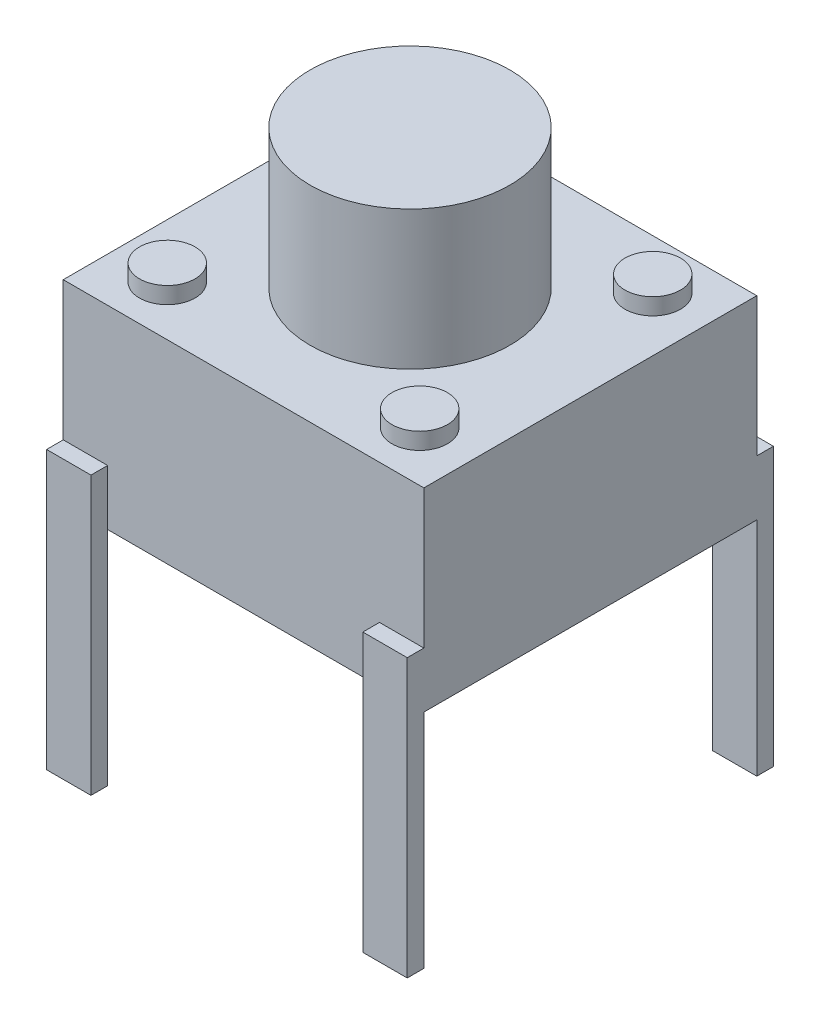
ISO-10303-21;
HEADER;
FILE_DESCRIPTION(('STEP AP214'),'2;1');
FILE_NAME('part.step','',(''),(''),'','','');
FILE_SCHEMA(('AUTOMOTIVE_DESIGN { 1 0 10303 214 1 1 1 1 }'));
ENDSEC;
DATA;
#1=APPLICATION_CONTEXT('core data for automotive mechanical design processes');
#2=APPLICATION_PROTOCOL_DEFINITION('international standard','automotive_design',2000,#1);
#3=PRODUCT_CONTEXT('',#1,'mechanical');
#4=PRODUCT('Part','Part','',(#3));
#5=PRODUCT_RELATED_PRODUCT_CATEGORY('part','',(#4));
#6=PRODUCT_DEFINITION_FORMATION('','',#4);
#7=PRODUCT_DEFINITION_CONTEXT('part definition',#1,'design');
#8=PRODUCT_DEFINITION('design','',#6,#7);
#9=PRODUCT_DEFINITION_SHAPE('','',#8);
#10=(LENGTH_UNIT() NAMED_UNIT(*) SI_UNIT(.MILLI.,.METRE.));
#11=(NAMED_UNIT(*) PLANE_ANGLE_UNIT() SI_UNIT($,.RADIAN.));
#12=(NAMED_UNIT(*) SI_UNIT($,.STERADIAN.) SOLID_ANGLE_UNIT());
#13=UNCERTAINTY_MEASURE_WITH_UNIT(LENGTH_MEASURE(1.E-05),#10,'distance_accuracy_value','');
#14=(GEOMETRIC_REPRESENTATION_CONTEXT(3) GLOBAL_UNCERTAINTY_ASSIGNED_CONTEXT((#13)) GLOBAL_UNIT_ASSIGNED_CONTEXT((#10,
#11,#12)) REPRESENTATION_CONTEXT('',''));
#15=CARTESIAN_POINT('',(0.,0.,0.));
#16=DIRECTION('',(0.,0.,1.));
#17=DIRECTION('',(1.,0.,0.));
#18=AXIS2_PLACEMENT_3D('',#15,#16,#17);
#19=CARTESIAN_POINT('',(-3.25,3.5,-3.));
#20=DIRECTION('',(0.,0.,-1.));
#21=DIRECTION('',(-1.,0.,0.));
#22=AXIS2_PLACEMENT_3D('',#19,#20,#21);
#23=PLANE('',#22);
#24=DIRECTION('',(-1.,0.,0.));
#25=VECTOR('',#24,1.);
#26=CARTESIAN_POINT('',(2.45,1.,-3.));
#27=LINE('',#26,#25);
#28=CARTESIAN_POINT('',(3.25,1.,-3.));
#29=VERTEX_POINT('',#28);
#30=CARTESIAN_POINT('',(2.45,1.,-3.));
#31=VERTEX_POINT('',#30);
#32=EDGE_CURVE('E212',#29,#31,#27,.T.);
#33=ORIENTED_EDGE('',*,*,#32,.T.);
#34=DIRECTION('',(0.,1.,0.));
#35=VECTOR('',#34,1.);
#36=CARTESIAN_POINT('',(2.45,-4.,-3.));
#37=LINE('',#36,#35);
#38=CARTESIAN_POINT('',(2.45,0.,-3.));
#39=VERTEX_POINT('',#38);
#40=EDGE_CURVE('E399',#39,#31,#37,.T.);
#41=ORIENTED_EDGE('',*,*,#40,.F.);
#42=DIRECTION('',(1.,0.,0.));
#43=VECTOR('',#42,1.);
#44=CARTESIAN_POINT('',(-3.25,0.,-3.));
#45=LINE('',#44,#43);
#46=CARTESIAN_POINT('',(-2.45,0.,-3.));
#47=VERTEX_POINT('',#46);
#48=EDGE_CURVE('E359',#47,#39,#45,.T.);
#49=ORIENTED_EDGE('',*,*,#48,.F.);
#50=DIRECTION('',(0.,1.,0.));
#51=VECTOR('',#50,1.);
#52=CARTESIAN_POINT('',(-2.45,-4.,-3.));
#53=LINE('',#52,#51);
#54=CARTESIAN_POINT('',(-2.45,1.,-3.));
#55=VERTEX_POINT('',#54);
#56=EDGE_CURVE('E11',#47,#55,#53,.T.);
#57=ORIENTED_EDGE('',*,*,#56,.T.);
#58=DIRECTION('',(-1.,0.,0.));
#59=VECTOR('',#58,1.);
#60=CARTESIAN_POINT('',(-3.25,1.,-3.));
#61=LINE('',#60,#59);
#62=CARTESIAN_POINT('',(-3.25,1.,-3.));
#63=VERTEX_POINT('',#62);
#64=EDGE_CURVE('E56',#55,#63,#61,.T.);
#65=ORIENTED_EDGE('',*,*,#64,.T.);
#66=DIRECTION('',(0.,-1.,0.));
#67=VECTOR('',#66,1.);
#68=CARTESIAN_POINT('',(-3.25,3.5,-3.));
#69=LINE('',#68,#67);
#70=CARTESIAN_POINT('',(-3.25,3.5,-3.));
#71=VERTEX_POINT('',#70);
#72=EDGE_CURVE('E42',#71,#63,#69,.T.);
#73=ORIENTED_EDGE('',*,*,#72,.F.);
#74=DIRECTION('',(1.,0.,0.));
#75=VECTOR('',#74,1.);
#76=CARTESIAN_POINT('',(-3.25,3.5,-3.));
#77=LINE('',#76,#75);
#78=CARTESIAN_POINT('',(3.25,3.5,-3.));
#79=VERTEX_POINT('',#78);
#80=EDGE_CURVE('E344',#71,#79,#77,.T.);
#81=ORIENTED_EDGE('',*,*,#80,.T.);
#82=DIRECTION('',(0.,-1.,0.));
#83=VECTOR('',#82,1.);
#84=CARTESIAN_POINT('',(3.25,3.5,-3.));
#85=LINE('',#84,#83);
#86=EDGE_CURVE('E369',#79,#29,#85,.T.);
#87=ORIENTED_EDGE('',*,*,#86,.T.);
#88=EDGE_LOOP('',(#33,#41,#49,#57,#65,#73,#81,#87));
#89=FACE_BOUND('',#88,.T.);
#90=ADVANCED_FACE('F38',(#89),#23,.T.);
#91=CARTESIAN_POINT('',(-3.25,3.5,3.));
#92=DIRECTION('',(0.,0.,-1.));
#93=DIRECTION('',(-1.,0.,0.));
#94=AXIS2_PLACEMENT_3D('',#91,#92,#93);
#95=PLANE('',#94);
#96=DIRECTION('',(0.,1.,0.));
#97=VECTOR('',#96,1.);
#98=CARTESIAN_POINT('',(2.45,-4.,3.));
#99=LINE('',#98,#97);
#100=CARTESIAN_POINT('',(2.45,0.,3.));
#101=VERTEX_POINT('',#100);
#102=CARTESIAN_POINT('',(2.45,1.,3.));
#103=VERTEX_POINT('',#102);
#104=EDGE_CURVE('E64',#101,#103,#99,.T.);
#105=ORIENTED_EDGE('',*,*,#104,.T.);
#106=DIRECTION('',(1.,0.,0.));
#107=VECTOR('',#106,1.);
#108=CARTESIAN_POINT('',(3.25,1.,3.));
#109=LINE('',#108,#107);
#110=CARTESIAN_POINT('',(3.25,1.,3.));
#111=VERTEX_POINT('',#110);
#112=EDGE_CURVE('E254',#103,#111,#109,.T.);
#113=ORIENTED_EDGE('',*,*,#112,.T.);
#114=DIRECTION('',(0.,-1.,0.));
#115=VECTOR('',#114,1.);
#116=CARTESIAN_POINT('',(3.25,3.5,3.));
#117=LINE('',#116,#115);
#118=CARTESIAN_POINT('',(3.25,3.5,3.));
#119=VERTEX_POINT('',#118);
#120=EDGE_CURVE('E367',#119,#111,#117,.T.);
#121=ORIENTED_EDGE('',*,*,#120,.F.);
#122=DIRECTION('',(1.,0.,0.));
#123=VECTOR('',#122,1.);
#124=CARTESIAN_POINT('',(-3.25,3.5,3.));
#125=LINE('',#124,#123);
#126=CARTESIAN_POINT('',(-3.25,3.5,3.));
#127=VERTEX_POINT('',#126);
#128=EDGE_CURVE('E350',#127,#119,#125,.T.);
#129=ORIENTED_EDGE('',*,*,#128,.F.);
#130=DIRECTION('',(0.,-1.,0.));
#131=VECTOR('',#130,1.);
#132=CARTESIAN_POINT('',(-3.25,3.5,3.));
#133=LINE('',#132,#131);
#134=CARTESIAN_POINT('',(-3.25,1.,3.));
#135=VERTEX_POINT('',#134);
#136=EDGE_CURVE('E340',#127,#135,#133,.T.);
#137=ORIENTED_EDGE('',*,*,#136,.T.);
#138=DIRECTION('',(1.,0.,0.));
#139=VECTOR('',#138,1.);
#140=CARTESIAN_POINT('',(-3.25,1.,3.));
#141=LINE('',#140,#139);
#142=CARTESIAN_POINT('',(-2.45,1.,3.));
#143=VERTEX_POINT('',#142);
#144=EDGE_CURVE('E293',#135,#143,#141,.T.);
#145=ORIENTED_EDGE('',*,*,#144,.T.);
#146=DIRECTION('',(0.,1.,0.));
#147=VECTOR('',#146,1.);
#148=CARTESIAN_POINT('',(-2.45,-4.,3.));
#149=LINE('',#148,#147);
#150=CARTESIAN_POINT('',(-2.45,0.,3.));
#151=VERTEX_POINT('',#150);
#152=EDGE_CURVE('E47',#151,#143,#149,.T.);
#153=ORIENTED_EDGE('',*,*,#152,.F.);
#154=DIRECTION('',(1.,0.,0.));
#155=VECTOR('',#154,1.);
#156=CARTESIAN_POINT('',(-3.25,0.,3.));
#157=LINE('',#156,#155);
#158=EDGE_CURVE('E365',#151,#101,#157,.T.);
#159=ORIENTED_EDGE('',*,*,#158,.T.);
#160=EDGE_LOOP('',(#105,#113,#121,#129,#137,#145,#153,#159));
#161=FACE_BOUND('',#160,.T.);
#162=ADVANCED_FACE('F417',(#161),#95,.F.);
#163=CARTESIAN_POINT('',(-3.25,3.5,3.));
#164=DIRECTION('',(-1.,0.,0.));
#165=DIRECTION('',(0.,0.,1.));
#166=AXIS2_PLACEMENT_3D('',#163,#164,#165);
#167=PLANE('',#166);
#168=DIRECTION('',(0.,0.,-1.));
#169=VECTOR('',#168,1.);
#170=CARTESIAN_POINT('',(-3.25,0.,3.));
#171=LINE('',#170,#169);
#172=CARTESIAN_POINT('',(-3.25,0.,3.));
#173=VERTEX_POINT('',#172);
#174=CARTESIAN_POINT('',(-3.25,0.,-3.));
#175=VERTEX_POINT('',#174);
#176=EDGE_CURVE('E336',#173,#175,#171,.T.);
#177=ORIENTED_EDGE('',*,*,#176,.F.);
#178=DIRECTION('',(0.,1.,0.));
#179=VECTOR('',#178,1.);
#180=CARTESIAN_POINT('',(-3.25,-4.,3.));
#181=LINE('',#180,#179);
#182=CARTESIAN_POINT('',(-3.25,-4.,3.));
#183=VERTEX_POINT('',#182);
#184=EDGE_CURVE('E306',#183,#173,#181,.T.);
#185=ORIENTED_EDGE('',*,*,#184,.F.);
#186=DIRECTION('',(0.,0.,-1.));
#187=VECTOR('',#186,1.);
#188=CARTESIAN_POINT('',(-3.25,-4.,3.));
#189=LINE('',#188,#187);
#190=CARTESIAN_POINT('',(-3.25,-4.,3.3));
#191=VERTEX_POINT('',#190);
#192=EDGE_CURVE('E280',#191,#183,#189,.T.);
#193=ORIENTED_EDGE('',*,*,#192,.F.);
#194=DIRECTION('',(0.,1.,0.));
#195=VECTOR('',#194,1.);
#196=CARTESIAN_POINT('',(-3.25,-4.,3.3));
#197=LINE('',#196,#195);
#198=CARTESIAN_POINT('',(-3.25,1.,3.3));
#199=VERTEX_POINT('',#198);
#200=EDGE_CURVE('E290',#191,#199,#197,.T.);
#201=ORIENTED_EDGE('',*,*,#200,.T.);
#202=DIRECTION('',(0.,0.,-1.));
#203=VECTOR('',#202,1.);
#204=CARTESIAN_POINT('',(-3.25,1.,3.));
#205=LINE('',#204,#203);
#206=EDGE_CURVE('E279',#199,#135,#205,.T.);
#207=ORIENTED_EDGE('',*,*,#206,.T.);
#208=ORIENTED_EDGE('',*,*,#136,.F.);
#209=DIRECTION('',(0.,0.,-1.));
#210=VECTOR('',#209,1.);
#211=CARTESIAN_POINT('',(-3.25,3.5,3.));
#212=LINE('',#211,#210);
#213=EDGE_CURVE('E341',#127,#71,#212,.T.);
#214=ORIENTED_EDGE('',*,*,#213,.T.);
#215=ORIENTED_EDGE('',*,*,#72,.T.);
#216=DIRECTION('',(0.,0.,-1.));
#217=VECTOR('',#216,1.);
#218=CARTESIAN_POINT('',(-3.25,1.,-3.));
#219=LINE('',#218,#217);
#220=CARTESIAN_POINT('',(-3.25,1.,-3.3));
#221=VERTEX_POINT('',#220);
#222=EDGE_CURVE('E217',#63,#221,#219,.T.);
#223=ORIENTED_EDGE('',*,*,#222,.T.);
#224=DIRECTION('',(0.,1.,0.));
#225=VECTOR('',#224,1.);
#226=CARTESIAN_POINT('',(-3.25,-4.,-3.3));
#227=LINE('',#226,#225);
#228=CARTESIAN_POINT('',(-3.25,-4.,-3.3));
#229=VERTEX_POINT('',#228);
#230=EDGE_CURVE('E246',#229,#221,#227,.T.);
#231=ORIENTED_EDGE('',*,*,#230,.F.);
#232=DIRECTION('',(0.,0.,-1.));
#233=VECTOR('',#232,1.);
#234=CARTESIAN_POINT('',(-3.25,-4.,-3.));
#235=LINE('',#234,#233);
#236=CARTESIAN_POINT('',(-3.25,-4.,-3.));
#237=VERTEX_POINT('',#236);
#238=EDGE_CURVE('E226',#237,#229,#235,.T.);
#239=ORIENTED_EDGE('',*,*,#238,.F.);
#240=DIRECTION('',(0.,1.,0.));
#241=VECTOR('',#240,1.);
#242=CARTESIAN_POINT('',(-3.25,-4.,-3.));
#243=LINE('',#242,#241);
#244=EDGE_CURVE('E234',#237,#175,#243,.T.);
#245=ORIENTED_EDGE('',*,*,#244,.T.);
#246=EDGE_LOOP('',(#177,#185,#193,#201,#207,#208,#214,#215,#223,#231,#239,#245));
#247=FACE_BOUND('',#246,.T.);
#248=ADVANCED_FACE('F40',(#247),#167,.T.);
#249=CARTESIAN_POINT('',(3.25,3.5,3.));
#250=DIRECTION('',(-1.,0.,0.));
#251=DIRECTION('',(0.,0.,1.));
#252=AXIS2_PLACEMENT_3D('',#249,#250,#251);
#253=PLANE('',#252);
#254=DIRECTION('',(0.,0.,-1.));
#255=VECTOR('',#254,1.);
#256=CARTESIAN_POINT('',(3.25,0.,3.));
#257=LINE('',#256,#255);
#258=CARTESIAN_POINT('',(3.25,0.,3.));
#259=VERTEX_POINT('',#258);
#260=CARTESIAN_POINT('',(3.25,0.,-3.));
#261=VERTEX_POINT('',#260);
#262=EDGE_CURVE('E358',#259,#261,#257,.T.);
#263=ORIENTED_EDGE('',*,*,#262,.T.);
#264=DIRECTION('',(0.,1.,0.));
#265=VECTOR('',#264,1.);
#266=CARTESIAN_POINT('',(3.25,-4.,-3.));
#267=LINE('',#266,#265);
#268=CARTESIAN_POINT('',(3.25,-4.,-3.));
#269=VERTEX_POINT('',#268);
#270=EDGE_CURVE('E222',#269,#261,#267,.T.);
#271=ORIENTED_EDGE('',*,*,#270,.F.);
#272=DIRECTION('',(0.,0.,1.));
#273=VECTOR('',#272,1.);
#274=CARTESIAN_POINT('',(3.25,-4.,-3.));
#275=LINE('',#274,#273);
#276=CARTESIAN_POINT('',(3.25,-4.,-3.3));
#277=VERTEX_POINT('',#276);
#278=EDGE_CURVE('E202',#277,#269,#275,.T.);
#279=ORIENTED_EDGE('',*,*,#278,.F.);
#280=DIRECTION('',(0.,1.,0.));
#281=VECTOR('',#280,1.);
#282=CARTESIAN_POINT('',(3.25,-4.,-3.3));
#283=LINE('',#282,#281);
#284=CARTESIAN_POINT('',(3.25,1.,-3.3));
#285=VERTEX_POINT('',#284);
#286=EDGE_CURVE('E199',#277,#285,#283,.T.);
#287=ORIENTED_EDGE('',*,*,#286,.T.);
#288=DIRECTION('',(0.,0.,1.));
#289=VECTOR('',#288,1.);
#290=CARTESIAN_POINT('',(3.25,1.,-3.));
#291=LINE('',#290,#289);
#292=EDGE_CURVE('E388',#285,#29,#291,.T.);
#293=ORIENTED_EDGE('',*,*,#292,.T.);
#294=ORIENTED_EDGE('',*,*,#86,.F.);
#295=DIRECTION('',(0.,0.,-1.));
#296=VECTOR('',#295,1.);
#297=CARTESIAN_POINT('',(3.25,3.5,3.));
#298=LINE('',#297,#296);
#299=EDGE_CURVE('E348',#119,#79,#298,.T.);
#300=ORIENTED_EDGE('',*,*,#299,.F.);
#301=ORIENTED_EDGE('',*,*,#120,.T.);
#302=DIRECTION('',(0.,0.,1.));
#303=VECTOR('',#302,1.);
#304=CARTESIAN_POINT('',(3.25,1.,3.));
#305=LINE('',#304,#303);
#306=CARTESIAN_POINT('',(3.25,1.,3.3));
#307=VERTEX_POINT('',#306);
#308=EDGE_CURVE('E249',#111,#307,#305,.T.);
#309=ORIENTED_EDGE('',*,*,#308,.T.);
#310=DIRECTION('',(0.,1.,0.));
#311=VECTOR('',#310,1.);
#312=CARTESIAN_POINT('',(3.25,-4.,3.3));
#313=LINE('',#312,#311);
#314=CARTESIAN_POINT('',(3.25,-4.,3.3));
#315=VERTEX_POINT('',#314);
#316=EDGE_CURVE('E276',#315,#307,#313,.T.);
#317=ORIENTED_EDGE('',*,*,#316,.F.);
#318=DIRECTION('',(0.,0.,1.));
#319=VECTOR('',#318,1.);
#320=CARTESIAN_POINT('',(3.25,-4.,3.));
#321=LINE('',#320,#319);
#322=CARTESIAN_POINT('',(3.25,-4.,3.));
#323=VERTEX_POINT('',#322);
#324=EDGE_CURVE('E250',#323,#315,#321,.T.);
#325=ORIENTED_EDGE('',*,*,#324,.F.);
#326=DIRECTION('',(0.,1.,0.));
#327=VECTOR('',#326,1.);
#328=CARTESIAN_POINT('',(3.25,-4.,3.));
#329=LINE('',#328,#327);
#330=EDGE_CURVE('E260',#323,#259,#329,.T.);
#331=ORIENTED_EDGE('',*,*,#330,.T.);
#332=EDGE_LOOP('',(#263,#271,#279,#287,#293,#294,#300,#301,#309,#317,#325,#331));
#333=FACE_BOUND('',#332,.T.);
#334=ADVANCED_FACE('F386',(#333),#253,.F.);
#335=CARTESIAN_POINT('',(0.,3.5,0.));
#336=DIRECTION('',(0.,-1.,0.));
#337=DIRECTION('',(0.,0.,-1.));
#338=AXIS2_PLACEMENT_3D('',#335,#336,#337);
#339=PLANE('',#338);
#340=CARTESIAN_POINT('',(2.275,3.5,2.1));
#341=DIRECTION('',(0.,-1.,0.));
#342=DIRECTION('',(0.,0.,-1.));
#343=AXIS2_PLACEMENT_3D('',#340,#341,#342);
#344=CIRCLE('',#343,0.5);
#345=CARTESIAN_POINT('',(2.275,3.5,1.6));
#346=VERTEX_POINT('',#345);
#347=EDGE_CURVE('E310',#346,#346,#344,.T.);
#348=ORIENTED_EDGE('',*,*,#347,.T.);
#349=EDGE_LOOP('',(#348));
#350=FACE_BOUND('',#349,.T.);
#351=CARTESIAN_POINT('',(2.275,3.5,-2.1));
#352=DIRECTION('',(0.,-1.,0.));
#353=DIRECTION('',(0.,0.,-1.));
#354=AXIS2_PLACEMENT_3D('',#351,#352,#353);
#355=CIRCLE('',#354,0.5);
#356=CARTESIAN_POINT('',(2.275,3.5,-2.6));
#357=VERTEX_POINT('',#356);
#358=EDGE_CURVE('E316',#357,#357,#355,.T.);
#359=ORIENTED_EDGE('',*,*,#358,.T.);
#360=EDGE_LOOP('',(#359));
#361=FACE_BOUND('',#360,.T.);
#362=CARTESIAN_POINT('',(-2.275,3.5,2.1));
#363=DIRECTION('',(0.,-1.,0.));
#364=DIRECTION('',(0.,0.,-1.));
#365=AXIS2_PLACEMENT_3D('',#362,#363,#364);
#366=CIRCLE('',#365,0.5);
#367=CARTESIAN_POINT('',(-2.275,3.5,1.6));
#368=VERTEX_POINT('',#367);
#369=EDGE_CURVE('E322',#368,#368,#366,.T.);
#370=ORIENTED_EDGE('',*,*,#369,.T.);
#371=EDGE_LOOP('',(#370));
#372=FACE_BOUND('',#371,.T.);
#373=CARTESIAN_POINT('',(-2.275,3.5,-2.1));
#374=DIRECTION('',(0.,-1.,0.));
#375=DIRECTION('',(0.,0.,-1.));
#376=AXIS2_PLACEMENT_3D('',#373,#374,#375);
#377=CIRCLE('',#376,0.5);
#378=CARTESIAN_POINT('',(-2.275,3.5,-2.6));
#379=VERTEX_POINT('',#378);
#380=EDGE_CURVE('E325',#379,#379,#377,.T.);
#381=ORIENTED_EDGE('',*,*,#380,.T.);
#382=EDGE_LOOP('',(#381));
#383=FACE_BOUND('',#382,.T.);
#384=CARTESIAN_POINT('',(0.,3.5,0.));
#385=DIRECTION('',(0.,-1.,0.));
#386=DIRECTION('',(0.,0.,-1.));
#387=AXIS2_PLACEMENT_3D('',#384,#385,#386);
#388=CIRCLE('',#387,1.8);
#389=CARTESIAN_POINT('',(0.,3.5,-1.8));
#390=VERTEX_POINT('',#389);
#391=EDGE_CURVE('E337',#390,#390,#388,.F.);
#392=ORIENTED_EDGE('',*,*,#391,.F.);
#393=EDGE_LOOP('',(#392));
#394=FACE_BOUND('',#393,.T.);
#395=ORIENTED_EDGE('',*,*,#213,.F.);
#396=ORIENTED_EDGE('',*,*,#128,.T.);
#397=ORIENTED_EDGE('',*,*,#299,.T.);
#398=ORIENTED_EDGE('',*,*,#80,.F.);
#399=EDGE_LOOP('',(#395,#396,#397,#398));
#400=FACE_BOUND('',#399,.T.);
#401=ADVANCED_FACE('F381',(#350,#361,#372,#383,#394,#400),#339,.F.);
#402=CARTESIAN_POINT('',(0.,0.,0.));
#403=DIRECTION('',(0.,-1.,0.));
#404=DIRECTION('',(0.,0.,-1.));
#405=AXIS2_PLACEMENT_3D('',#402,#403,#404);
#406=PLANE('',#405);
#407=ORIENTED_EDGE('',*,*,#176,.T.);
#408=EDGE_CURVE('E355',#175,#47,#45,.T.);
#409=ORIENTED_EDGE('',*,*,#408,.T.);
#410=ORIENTED_EDGE('',*,*,#48,.T.);
#411=EDGE_CURVE('E354',#39,#261,#45,.T.);
#412=ORIENTED_EDGE('',*,*,#411,.T.);
#413=ORIENTED_EDGE('',*,*,#262,.F.);
#414=EDGE_CURVE('E362',#101,#259,#157,.T.);
#415=ORIENTED_EDGE('',*,*,#414,.F.);
#416=ORIENTED_EDGE('',*,*,#158,.F.);
#417=EDGE_CURVE('E345',#173,#151,#157,.T.);
#418=ORIENTED_EDGE('',*,*,#417,.F.);
#419=EDGE_LOOP('',(#407,#409,#410,#412,#413,#415,#416,#418));
#420=FACE_BOUND('',#419,.T.);
#421=ADVANCED_FACE('F406',(#420),#406,.T.);
#422=CARTESIAN_POINT('',(0.,6.,0.));
#423=DIRECTION('',(0.,-1.,0.));
#424=DIRECTION('',(0.,0.,-1.));
#425=AXIS2_PLACEMENT_3D('',#422,#423,#424);
#426=CYLINDRICAL_SURFACE('',#425,1.8);
#427=CARTESIAN_POINT('',(0.,6.,0.));
#428=DIRECTION('',(0.,1.,0.));
#429=DIRECTION('',(0.,0.,1.));
#430=AXIS2_PLACEMENT_3D('',#427,#428,#429);
#431=CIRCLE('',#430,1.8);
#432=CARTESIAN_POINT('',(0.,6.,1.8));
#433=VERTEX_POINT('',#432);
#434=EDGE_CURVE('E331',#433,#433,#431,.T.);
#435=ORIENTED_EDGE('',*,*,#434,.F.);
#436=EDGE_LOOP('',(#435));
#437=FACE_BOUND('',#436,.T.);
#438=ORIENTED_EDGE('',*,*,#391,.T.);
#439=EDGE_LOOP('',(#438));
#440=FACE_BOUND('',#439,.T.);
#441=ADVANCED_FACE('F452',(#437,#440),#426,.T.);
#442=CARTESIAN_POINT('',(0.,6.,0.));
#443=DIRECTION('',(0.,1.,0.));
#444=DIRECTION('',(0.,0.,1.));
#445=AXIS2_PLACEMENT_3D('',#442,#443,#444);
#446=PLANE('',#445);
#447=ORIENTED_EDGE('',*,*,#434,.T.);
#448=EDGE_LOOP('',(#447));
#449=FACE_BOUND('',#448,.T.);
#450=ADVANCED_FACE('F458',(#449),#446,.T.);
#451=CARTESIAN_POINT('',(-2.275,3.8,-2.1));
#452=DIRECTION('',(0.,-1.,0.));
#453=DIRECTION('',(0.,0.,-1.));
#454=AXIS2_PLACEMENT_3D('',#451,#452,#453);
#455=CYLINDRICAL_SURFACE('',#454,0.5);
#456=CARTESIAN_POINT('',(-2.275,3.8,-2.1));
#457=DIRECTION('',(0.,-1.,0.));
#458=DIRECTION('',(0.,0.,-1.));
#459=AXIS2_PLACEMENT_3D('',#456,#457,#458);
#460=CIRCLE('',#459,0.5);
#461=CARTESIAN_POINT('',(-2.275,3.8,-2.6));
#462=VERTEX_POINT('',#461);
#463=EDGE_CURVE('E328',#462,#462,#460,.T.);
#464=ORIENTED_EDGE('',*,*,#463,.T.);
#465=EDGE_LOOP('',(#464));
#466=FACE_BOUND('',#465,.T.);
#467=ORIENTED_EDGE('',*,*,#380,.F.);
#468=EDGE_LOOP('',(#467));
#469=FACE_BOUND('',#468,.T.);
#470=ADVANCED_FACE('F462',(#466,#469),#455,.T.);
#471=CARTESIAN_POINT('',(-2.275,3.8,-2.1));
#472=DIRECTION('',(0.,-1.,0.));
#473=DIRECTION('',(0.,0.,-1.));
#474=AXIS2_PLACEMENT_3D('',#471,#472,#473);
#475=PLANE('',#474);
#476=ORIENTED_EDGE('',*,*,#463,.F.);
#477=EDGE_LOOP('',(#476));
#478=FACE_BOUND('',#477,.T.);
#479=ADVANCED_FACE('F466',(#478),#475,.F.);
#480=CARTESIAN_POINT('',(-2.275,3.8,2.1));
#481=DIRECTION('',(0.,-1.,0.));
#482=DIRECTION('',(0.,0.,-1.));
#483=AXIS2_PLACEMENT_3D('',#480,#481,#482);
#484=CYLINDRICAL_SURFACE('',#483,0.5);
#485=CARTESIAN_POINT('',(-2.275,3.8,2.1));
#486=DIRECTION('',(0.,-1.,0.));
#487=DIRECTION('',(0.,0.,-1.));
#488=AXIS2_PLACEMENT_3D('',#485,#486,#487);
#489=CIRCLE('',#488,0.5);
#490=CARTESIAN_POINT('',(-2.275,3.8,1.6));
#491=VERTEX_POINT('',#490);
#492=EDGE_CURVE('E319',#491,#491,#489,.T.);
#493=ORIENTED_EDGE('',*,*,#492,.T.);
#494=EDGE_LOOP('',(#493));
#495=FACE_BOUND('',#494,.T.);
#496=ORIENTED_EDGE('',*,*,#369,.F.);
#497=EDGE_LOOP('',(#496));
#498=FACE_BOUND('',#497,.T.);
#499=ADVANCED_FACE('F470',(#495,#498),#484,.T.);
#500=CARTESIAN_POINT('',(-2.275,3.8,2.1));
#501=DIRECTION('',(0.,-1.,0.));
#502=DIRECTION('',(0.,0.,-1.));
#503=AXIS2_PLACEMENT_3D('',#500,#501,#502);
#504=PLANE('',#503);
#505=ORIENTED_EDGE('',*,*,#492,.F.);
#506=EDGE_LOOP('',(#505));
#507=FACE_BOUND('',#506,.T.);
#508=ADVANCED_FACE('F472',(#507),#504,.F.);
#509=CARTESIAN_POINT('',(2.275,3.8,-2.1));
#510=DIRECTION('',(0.,-1.,0.));
#511=DIRECTION('',(0.,0.,-1.));
#512=AXIS2_PLACEMENT_3D('',#509,#510,#511);
#513=CYLINDRICAL_SURFACE('',#512,0.5);
#514=CARTESIAN_POINT('',(2.275,3.8,-2.1));
#515=DIRECTION('',(0.,-1.,0.));
#516=DIRECTION('',(0.,0.,-1.));
#517=AXIS2_PLACEMENT_3D('',#514,#515,#516);
#518=CIRCLE('',#517,0.5);
#519=CARTESIAN_POINT('',(2.275,3.8,-2.6));
#520=VERTEX_POINT('',#519);
#521=EDGE_CURVE('E313',#520,#520,#518,.T.);
#522=ORIENTED_EDGE('',*,*,#521,.T.);
#523=EDGE_LOOP('',(#522));
#524=FACE_BOUND('',#523,.T.);
#525=ORIENTED_EDGE('',*,*,#358,.F.);
#526=EDGE_LOOP('',(#525));
#527=FACE_BOUND('',#526,.T.);
#528=ADVANCED_FACE('F475',(#524,#527),#513,.T.);
#529=CARTESIAN_POINT('',(2.275,3.8,-2.1));
#530=DIRECTION('',(0.,-1.,0.));
#531=DIRECTION('',(0.,0.,-1.));
#532=AXIS2_PLACEMENT_3D('',#529,#530,#531);
#533=PLANE('',#532);
#534=ORIENTED_EDGE('',*,*,#521,.F.);
#535=EDGE_LOOP('',(#534));
#536=FACE_BOUND('',#535,.T.);
#537=ADVANCED_FACE('F480',(#536),#533,.F.);
#538=CARTESIAN_POINT('',(2.275,3.8,2.1));
#539=DIRECTION('',(0.,-1.,0.));
#540=DIRECTION('',(0.,0.,-1.));
#541=AXIS2_PLACEMENT_3D('',#538,#539,#540);
#542=CYLINDRICAL_SURFACE('',#541,0.5);
#543=CARTESIAN_POINT('',(2.275,3.8,2.1));
#544=DIRECTION('',(0.,-1.,0.));
#545=DIRECTION('',(0.,0.,-1.));
#546=AXIS2_PLACEMENT_3D('',#543,#544,#545);
#547=CIRCLE('',#546,0.5);
#548=CARTESIAN_POINT('',(2.275,3.8,1.6));
#549=VERTEX_POINT('',#548);
#550=EDGE_CURVE('E309',#549,#549,#547,.T.);
#551=ORIENTED_EDGE('',*,*,#550,.T.);
#552=EDGE_LOOP('',(#551));
#553=FACE_BOUND('',#552,.T.);
#554=ORIENTED_EDGE('',*,*,#347,.F.);
#555=EDGE_LOOP('',(#554));
#556=FACE_BOUND('',#555,.T.);
#557=ADVANCED_FACE('F483',(#553,#556),#542,.T.);
#558=CARTESIAN_POINT('',(2.275,3.8,2.1));
#559=DIRECTION('',(0.,-1.,0.));
#560=DIRECTION('',(0.,0.,-1.));
#561=AXIS2_PLACEMENT_3D('',#558,#559,#560);
#562=PLANE('',#561);
#563=ORIENTED_EDGE('',*,*,#550,.F.);
#564=EDGE_LOOP('',(#563));
#565=FACE_BOUND('',#564,.T.);
#566=ADVANCED_FACE('F488',(#565),#562,.F.);
#567=CARTESIAN_POINT('',(-3.25,-4.,3.));
#568=DIRECTION('',(0.,0.,1.));
#569=DIRECTION('',(1.,0.,0.));
#570=AXIS2_PLACEMENT_3D('',#567,#568,#569);
#571=PLANE('',#570);
#572=ORIENTED_EDGE('',*,*,#184,.T.);
#573=ORIENTED_EDGE('',*,*,#417,.T.);
#574=CARTESIAN_POINT('',(-2.45,-4.,3.));
#575=VERTEX_POINT('',#574);
#576=EDGE_CURVE('E303',#575,#151,#149,.T.);
#577=ORIENTED_EDGE('',*,*,#576,.F.);
#578=DIRECTION('',(1.,0.,0.));
#579=VECTOR('',#578,1.);
#580=CARTESIAN_POINT('',(-3.25,-4.,3.));
#581=LINE('',#580,#579);
#582=EDGE_CURVE('E283',#183,#575,#581,.T.);
#583=ORIENTED_EDGE('',*,*,#582,.F.);
#584=EDGE_LOOP('',(#572,#573,#577,#583));
#585=FACE_BOUND('',#584,.T.);
#586=ADVANCED_FACE('F491',(#585),#571,.F.);
#587=CARTESIAN_POINT('',(-2.45,-4.,3.));
#588=DIRECTION('',(-1.,0.,0.));
#589=DIRECTION('',(0.,0.,1.));
#590=AXIS2_PLACEMENT_3D('',#587,#588,#589);
#591=PLANE('',#590);
#592=DIRECTION('',(0.,0.,1.));
#593=VECTOR('',#592,1.);
#594=CARTESIAN_POINT('',(-2.45,1.,3.));
#595=LINE('',#594,#593);
#596=CARTESIAN_POINT('',(-2.45,1.,3.3));
#597=VERTEX_POINT('',#596);
#598=EDGE_CURVE('E295',#143,#597,#595,.T.);
#599=ORIENTED_EDGE('',*,*,#598,.T.);
#600=DIRECTION('',(0.,1.,0.));
#601=VECTOR('',#600,1.);
#602=CARTESIAN_POINT('',(-2.45,-4.,3.3));
#603=LINE('',#602,#601);
#604=CARTESIAN_POINT('',(-2.45,-4.,3.3));
#605=VERTEX_POINT('',#604);
#606=EDGE_CURVE('E300',#605,#597,#603,.T.);
#607=ORIENTED_EDGE('',*,*,#606,.F.);
#608=DIRECTION('',(0.,0.,1.));
#609=VECTOR('',#608,1.);
#610=CARTESIAN_POINT('',(-2.45,-4.,3.));
#611=LINE('',#610,#609);
#612=EDGE_CURVE('E286',#575,#605,#611,.T.);
#613=ORIENTED_EDGE('',*,*,#612,.F.);
#614=ORIENTED_EDGE('',*,*,#576,.T.);
#615=ORIENTED_EDGE('',*,*,#152,.T.);
#616=EDGE_LOOP('',(#599,#607,#613,#614,#615));
#617=FACE_BOUND('',#616,.T.);
#618=ADVANCED_FACE('F498',(#617),#591,.F.);
#619=CARTESIAN_POINT('',(-3.25,-4.,3.3));
#620=DIRECTION('',(0.,0.,-1.));
#621=DIRECTION('',(-1.,0.,0.));
#622=AXIS2_PLACEMENT_3D('',#619,#620,#621);
#623=PLANE('',#622);
#624=DIRECTION('',(-1.,0.,0.));
#625=VECTOR('',#624,1.);
#626=CARTESIAN_POINT('',(-3.25,1.,3.3));
#627=LINE('',#626,#625);
#628=EDGE_CURVE('E284',#597,#199,#627,.T.);
#629=ORIENTED_EDGE('',*,*,#628,.T.);
#630=ORIENTED_EDGE('',*,*,#200,.F.);
#631=DIRECTION('',(-1.,0.,0.));
#632=VECTOR('',#631,1.);
#633=CARTESIAN_POINT('',(-3.25,-4.,3.3));
#634=LINE('',#633,#632);
#635=EDGE_CURVE('E288',#605,#191,#634,.T.);
#636=ORIENTED_EDGE('',*,*,#635,.F.);
#637=ORIENTED_EDGE('',*,*,#606,.T.);
#638=EDGE_LOOP('',(#629,#630,#636,#637));
#639=FACE_BOUND('',#638,.T.);
#640=ADVANCED_FACE('F502',(#639),#623,.F.);
#641=CARTESIAN_POINT('',(0.,-4.,0.));
#642=DIRECTION('',(0.,1.,0.));
#643=DIRECTION('',(0.,0.,1.));
#644=AXIS2_PLACEMENT_3D('',#641,#642,#643);
#645=PLANE('',#644);
#646=ORIENTED_EDGE('',*,*,#192,.T.);
#647=ORIENTED_EDGE('',*,*,#582,.T.);
#648=ORIENTED_EDGE('',*,*,#612,.T.);
#649=ORIENTED_EDGE('',*,*,#635,.T.);
#650=EDGE_LOOP('',(#646,#647,#648,#649));
#651=FACE_BOUND('',#650,.T.);
#652=ADVANCED_FACE('F506',(#651),#645,.F.);
#653=CARTESIAN_POINT('',(0.,1.,0.));
#654=DIRECTION('',(0.,1.,0.));
#655=DIRECTION('',(0.,0.,1.));
#656=AXIS2_PLACEMENT_3D('',#653,#654,#655);
#657=PLANE('',#656);
#658=ORIENTED_EDGE('',*,*,#206,.F.);
#659=ORIENTED_EDGE('',*,*,#628,.F.);
#660=ORIENTED_EDGE('',*,*,#598,.F.);
#661=ORIENTED_EDGE('',*,*,#144,.F.);
#662=EDGE_LOOP('',(#658,#659,#660,#661));
#663=FACE_BOUND('',#662,.T.);
#664=ADVANCED_FACE('F508',(#663),#657,.T.);
#665=CARTESIAN_POINT('',(3.25,-4.,3.3));
#666=DIRECTION('',(0.,0.,-1.));
#667=DIRECTION('',(-1.,0.,0.));
#668=AXIS2_PLACEMENT_3D('',#665,#666,#667);
#669=PLANE('',#668);
#670=DIRECTION('',(-1.,0.,0.));
#671=VECTOR('',#670,1.);
#672=CARTESIAN_POINT('',(3.25,1.,3.3));
#673=LINE('',#672,#671);
#674=CARTESIAN_POINT('',(2.45,1.,3.3));
#675=VERTEX_POINT('',#674);
#676=EDGE_CURVE('E263',#307,#675,#673,.T.);
#677=ORIENTED_EDGE('',*,*,#676,.T.);
#678=DIRECTION('',(0.,1.,0.));
#679=VECTOR('',#678,1.);
#680=CARTESIAN_POINT('',(2.45,-4.,3.3));
#681=LINE('',#680,#679);
#682=CARTESIAN_POINT('',(2.45,-4.,3.3));
#683=VERTEX_POINT('',#682);
#684=EDGE_CURVE('E273',#683,#675,#681,.T.);
#685=ORIENTED_EDGE('',*,*,#684,.F.);
#686=DIRECTION('',(-1.,0.,0.));
#687=VECTOR('',#686,1.);
#688=CARTESIAN_POINT('',(3.25,-4.,3.3));
#689=LINE('',#688,#687);
#690=EDGE_CURVE('E253',#315,#683,#689,.T.);
#691=ORIENTED_EDGE('',*,*,#690,.F.);
#692=ORIENTED_EDGE('',*,*,#316,.T.);
#693=EDGE_LOOP('',(#677,#685,#691,#692));
#694=FACE_BOUND('',#693,.T.);
#695=ADVANCED_FACE('F429',(#694),#669,.F.);
#696=CARTESIAN_POINT('',(2.45,-4.,3.));
#697=DIRECTION('',(1.,0.,0.));
#698=DIRECTION('',(0.,0.,-1.));
#699=AXIS2_PLACEMENT_3D('',#696,#697,#698);
#700=PLANE('',#699);
#701=DIRECTION('',(0.,0.,-1.));
#702=VECTOR('',#701,1.);
#703=CARTESIAN_POINT('',(2.45,1.,3.));
#704=LINE('',#703,#702);
#705=EDGE_CURVE('E265',#675,#103,#704,.T.);
#706=ORIENTED_EDGE('',*,*,#705,.T.);
#707=ORIENTED_EDGE('',*,*,#104,.F.);
#708=CARTESIAN_POINT('',(2.45,-4.,3.));
#709=VERTEX_POINT('',#708);
#710=EDGE_CURVE('E270',#709,#101,#99,.T.);
#711=ORIENTED_EDGE('',*,*,#710,.F.);
#712=DIRECTION('',(0.,0.,-1.));
#713=VECTOR('',#712,1.);
#714=CARTESIAN_POINT('',(2.45,-4.,3.));
#715=LINE('',#714,#713);
#716=EDGE_CURVE('E256',#683,#709,#715,.T.);
#717=ORIENTED_EDGE('',*,*,#716,.F.);
#718=ORIENTED_EDGE('',*,*,#684,.T.);
#719=EDGE_LOOP('',(#706,#707,#711,#717,#718));
#720=FACE_BOUND('',#719,.T.);
#721=ADVANCED_FACE('F420',(#720),#700,.F.);
#722=CARTESIAN_POINT('',(3.25,-4.,3.));
#723=DIRECTION('',(0.,0.,1.));
#724=DIRECTION('',(1.,0.,0.));
#725=AXIS2_PLACEMENT_3D('',#722,#723,#724);
#726=PLANE('',#725);
#727=ORIENTED_EDGE('',*,*,#414,.T.);
#728=ORIENTED_EDGE('',*,*,#330,.F.);
#729=DIRECTION('',(1.,0.,0.));
#730=VECTOR('',#729,1.);
#731=CARTESIAN_POINT('',(3.25,-4.,3.));
#732=LINE('',#731,#730);
#733=EDGE_CURVE('E258',#709,#323,#732,.T.);
#734=ORIENTED_EDGE('',*,*,#733,.F.);
#735=ORIENTED_EDGE('',*,*,#710,.T.);
#736=EDGE_LOOP('',(#727,#728,#734,#735));
#737=FACE_BOUND('',#736,.T.);
#738=ADVANCED_FACE('F414',(#737),#726,.F.);
#739=CARTESIAN_POINT('',(0.,-4.,0.));
#740=DIRECTION('',(0.,-1.,0.));
#741=DIRECTION('',(0.,0.,-1.));
#742=AXIS2_PLACEMENT_3D('',#739,#740,#741);
#743=PLANE('',#742);
#744=ORIENTED_EDGE('',*,*,#324,.T.);
#745=ORIENTED_EDGE('',*,*,#690,.T.);
#746=ORIENTED_EDGE('',*,*,#716,.T.);
#747=ORIENTED_EDGE('',*,*,#733,.T.);
#748=EDGE_LOOP('',(#744,#745,#746,#747));
#749=FACE_BOUND('',#748,.T.);
#750=ADVANCED_FACE('F431',(#749),#743,.T.);
#751=CARTESIAN_POINT('',(0.,1.,0.));
#752=DIRECTION('',(0.,-1.,0.));
#753=DIRECTION('',(0.,0.,-1.));
#754=AXIS2_PLACEMENT_3D('',#751,#752,#753);
#755=PLANE('',#754);
#756=ORIENTED_EDGE('',*,*,#308,.F.);
#757=ORIENTED_EDGE('',*,*,#112,.F.);
#758=ORIENTED_EDGE('',*,*,#705,.F.);
#759=ORIENTED_EDGE('',*,*,#676,.F.);
#760=EDGE_LOOP('',(#756,#757,#758,#759));
#761=FACE_BOUND('',#760,.T.);
#762=ADVANCED_FACE('F427',(#761),#755,.F.);
#763=CARTESIAN_POINT('',(-3.25,-4.,-3.3));
#764=DIRECTION('',(0.,0.,1.));
#765=DIRECTION('',(1.,0.,0.));
#766=AXIS2_PLACEMENT_3D('',#763,#764,#765);
#767=PLANE('',#766);
#768=DIRECTION('',(1.,0.,0.));
#769=VECTOR('',#768,1.);
#770=CARTESIAN_POINT('',(-3.25,1.,-3.3));
#771=LINE('',#770,#769);
#772=CARTESIAN_POINT('',(-2.45,1.,-3.3));
#773=VERTEX_POINT('',#772);
#774=EDGE_CURVE('E220',#221,#773,#771,.T.);
#775=ORIENTED_EDGE('',*,*,#774,.T.);
#776=DIRECTION('',(0.,1.,0.));
#777=VECTOR('',#776,1.);
#778=CARTESIAN_POINT('',(-2.45,-4.,-3.3));
#779=LINE('',#778,#777);
#780=CARTESIAN_POINT('',(-2.45,-4.,-3.3));
#781=VERTEX_POINT('',#780);
#782=EDGE_CURVE('E243',#781,#773,#779,.T.);
#783=ORIENTED_EDGE('',*,*,#782,.F.);
#784=DIRECTION('',(1.,0.,0.));
#785=VECTOR('',#784,1.);
#786=CARTESIAN_POINT('',(-3.25,-4.,-3.3));
#787=LINE('',#786,#785);
#788=EDGE_CURVE('E229',#229,#781,#787,.T.);
#789=ORIENTED_EDGE('',*,*,#788,.F.);
#790=ORIENTED_EDGE('',*,*,#230,.T.);
#791=EDGE_LOOP('',(#775,#783,#789,#790));
#792=FACE_BOUND('',#791,.T.);
#793=ADVANCED_FACE('F438',(#792),#767,.F.);
#794=CARTESIAN_POINT('',(-2.45,-4.,-3.));
#795=DIRECTION('',(-1.,0.,0.));
#796=DIRECTION('',(0.,0.,1.));
#797=AXIS2_PLACEMENT_3D('',#794,#795,#796);
#798=PLANE('',#797);
#799=DIRECTION('',(0.,0.,1.));
#800=VECTOR('',#799,1.);
#801=CARTESIAN_POINT('',(-2.45,1.,-3.));
#802=LINE('',#801,#800);
#803=EDGE_CURVE('E237',#773,#55,#802,.T.);
#804=ORIENTED_EDGE('',*,*,#803,.T.);
#805=ORIENTED_EDGE('',*,*,#56,.F.);
#806=CARTESIAN_POINT('',(-2.45,-4.,-3.));
#807=VERTEX_POINT('',#806);
#808=EDGE_CURVE('E49',#807,#47,#53,.T.);
#809=ORIENTED_EDGE('',*,*,#808,.F.);
#810=DIRECTION('',(0.,0.,1.));
#811=VECTOR('',#810,1.);
#812=CARTESIAN_POINT('',(-2.45,-4.,-3.));
#813=LINE('',#812,#811);
#814=EDGE_CURVE('E231',#781,#807,#813,.T.);
#815=ORIENTED_EDGE('',*,*,#814,.F.);
#816=ORIENTED_EDGE('',*,*,#782,.T.);
#817=EDGE_LOOP('',(#804,#805,#809,#815,#816));
#818=FACE_BOUND('',#817,.T.);
#819=ADVANCED_FACE('F545',(#818),#798,.F.);
#820=CARTESIAN_POINT('',(-3.25,-4.,-3.));
#821=DIRECTION('',(0.,0.,-1.));
#822=DIRECTION('',(-1.,0.,0.));
#823=AXIS2_PLACEMENT_3D('',#820,#821,#822);
#824=PLANE('',#823);
#825=ORIENTED_EDGE('',*,*,#408,.F.);
#826=ORIENTED_EDGE('',*,*,#244,.F.);
#827=DIRECTION('',(-1.,0.,0.));
#828=VECTOR('',#827,1.);
#829=CARTESIAN_POINT('',(-3.25,-4.,-3.));
#830=LINE('',#829,#828);
#831=EDGE_CURVE('E233',#807,#237,#830,.T.);
#832=ORIENTED_EDGE('',*,*,#831,.F.);
#833=ORIENTED_EDGE('',*,*,#808,.T.);
#834=EDGE_LOOP('',(#825,#826,#832,#833));
#835=FACE_BOUND('',#834,.T.);
#836=ADVANCED_FACE('F554',(#835),#824,.F.);
#837=CARTESIAN_POINT('',(0.,-4.,0.));
#838=DIRECTION('',(0.,-1.,0.));
#839=DIRECTION('',(0.,0.,-1.));
#840=AXIS2_PLACEMENT_3D('',#837,#838,#839);
#841=PLANE('',#840);
#842=ORIENTED_EDGE('',*,*,#238,.T.);
#843=ORIENTED_EDGE('',*,*,#788,.T.);
#844=ORIENTED_EDGE('',*,*,#814,.T.);
#845=ORIENTED_EDGE('',*,*,#831,.T.);
#846=EDGE_LOOP('',(#842,#843,#844,#845));
#847=FACE_BOUND('',#846,.T.);
#848=ADVANCED_FACE('F564',(#847),#841,.T.);
#849=CARTESIAN_POINT('',(0.,1.,0.));
#850=DIRECTION('',(0.,-1.,0.));
#851=DIRECTION('',(0.,0.,-1.));
#852=AXIS2_PLACEMENT_3D('',#849,#850,#851);
#853=PLANE('',#852);
#854=ORIENTED_EDGE('',*,*,#222,.F.);
#855=ORIENTED_EDGE('',*,*,#64,.F.);
#856=ORIENTED_EDGE('',*,*,#803,.F.);
#857=ORIENTED_EDGE('',*,*,#774,.F.);
#858=EDGE_LOOP('',(#854,#855,#856,#857));
#859=FACE_BOUND('',#858,.T.);
#860=ADVANCED_FACE('F574',(#859),#853,.F.);
#861=CARTESIAN_POINT('',(2.45,-4.,-3.));
#862=DIRECTION('',(1.,0.,0.));
#863=DIRECTION('',(0.,0.,-1.));
#864=AXIS2_PLACEMENT_3D('',#861,#862,#863);
#865=PLANE('',#864);
#866=DIRECTION('',(0.,0.,-1.));
#867=VECTOR('',#866,1.);
#868=CARTESIAN_POINT('',(2.45,1.,-3.));
#869=LINE('',#868,#867);
#870=CARTESIAN_POINT('',(2.45,1.,-3.3));
#871=VERTEX_POINT('',#870);
#872=EDGE_CURVE('E216',#31,#871,#869,.T.);
#873=ORIENTED_EDGE('',*,*,#872,.T.);
#874=DIRECTION('',(0.,1.,0.));
#875=VECTOR('',#874,1.);
#876=CARTESIAN_POINT('',(2.45,-4.,-3.3));
#877=LINE('',#876,#875);
#878=CARTESIAN_POINT('',(2.45,-4.,-3.3));
#879=VERTEX_POINT('',#878);
#880=EDGE_CURVE('E196',#879,#871,#877,.T.);
#881=ORIENTED_EDGE('',*,*,#880,.F.);
#882=DIRECTION('',(0.,0.,-1.));
#883=VECTOR('',#882,1.);
#884=CARTESIAN_POINT('',(2.45,-4.,-3.));
#885=LINE('',#884,#883);
#886=CARTESIAN_POINT('',(2.45,-4.,-3.));
#887=VERTEX_POINT('',#886);
#888=EDGE_CURVE('E203',#887,#879,#885,.T.);
#889=ORIENTED_EDGE('',*,*,#888,.F.);
#890=EDGE_CURVE('E398',#887,#39,#37,.T.);
#891=ORIENTED_EDGE('',*,*,#890,.T.);
#892=ORIENTED_EDGE('',*,*,#40,.T.);
#893=EDGE_LOOP('',(#873,#881,#889,#891,#892));
#894=FACE_BOUND('',#893,.T.);
#895=ADVANCED_FACE('F214',(#894),#865,.F.);
#896=CARTESIAN_POINT('',(2.45,-4.,-3.3));
#897=DIRECTION('',(0.,0.,1.));
#898=DIRECTION('',(1.,0.,0.));
#899=AXIS2_PLACEMENT_3D('',#896,#897,#898);
#900=PLANE('',#899);
#901=DIRECTION('',(1.,0.,0.));
#902=VECTOR('',#901,1.);
#903=CARTESIAN_POINT('',(2.45,1.,-3.3));
#904=LINE('',#903,#902);
#905=EDGE_CURVE('E391',#871,#285,#904,.T.);
#906=ORIENTED_EDGE('',*,*,#905,.T.);
#907=ORIENTED_EDGE('',*,*,#286,.F.);
#908=DIRECTION('',(1.,0.,0.));
#909=VECTOR('',#908,1.);
#910=CARTESIAN_POINT('',(2.45,-4.,-3.3));
#911=LINE('',#910,#909);
#912=EDGE_CURVE('E192',#879,#277,#911,.T.);
#913=ORIENTED_EDGE('',*,*,#912,.F.);
#914=ORIENTED_EDGE('',*,*,#880,.T.);
#915=EDGE_LOOP('',(#906,#907,#913,#914));
#916=FACE_BOUND('',#915,.T.);
#917=ADVANCED_FACE('F194',(#916),#900,.F.);
#918=CARTESIAN_POINT('',(2.45,-4.,-3.));
#919=DIRECTION('',(0.,0.,-1.));
#920=DIRECTION('',(-1.,0.,0.));
#921=AXIS2_PLACEMENT_3D('',#918,#919,#920);
#922=PLANE('',#921);
#923=ORIENTED_EDGE('',*,*,#411,.F.);
#924=ORIENTED_EDGE('',*,*,#890,.F.);
#925=DIRECTION('',(-1.,0.,0.));
#926=VECTOR('',#925,1.);
#927=CARTESIAN_POINT('',(2.45,-4.,-3.));
#928=LINE('',#927,#926);
#929=EDGE_CURVE('E208',#269,#887,#928,.T.);
#930=ORIENTED_EDGE('',*,*,#929,.F.);
#931=ORIENTED_EDGE('',*,*,#270,.T.);
#932=EDGE_LOOP('',(#923,#924,#930,#931));
#933=FACE_BOUND('',#932,.T.);
#934=ADVANCED_FACE('F403',(#933),#922,.F.);
#935=CARTESIAN_POINT('',(0.,-4.,0.));
#936=DIRECTION('',(0.,-1.,0.));
#937=DIRECTION('',(0.,0.,-1.));
#938=AXIS2_PLACEMENT_3D('',#935,#936,#937);
#939=PLANE('',#938);
#940=ORIENTED_EDGE('',*,*,#888,.T.);
#941=ORIENTED_EDGE('',*,*,#912,.T.);
#942=ORIENTED_EDGE('',*,*,#278,.T.);
#943=ORIENTED_EDGE('',*,*,#929,.T.);
#944=EDGE_LOOP('',(#940,#941,#942,#943));
#945=FACE_BOUND('',#944,.T.);
#946=ADVANCED_FACE('F206',(#945),#939,.T.);
#947=CARTESIAN_POINT('',(0.,1.,0.));
#948=DIRECTION('',(0.,-1.,0.));
#949=DIRECTION('',(0.,0.,-1.));
#950=AXIS2_PLACEMENT_3D('',#947,#948,#949);
#951=PLANE('',#950);
#952=ORIENTED_EDGE('',*,*,#872,.F.);
#953=ORIENTED_EDGE('',*,*,#32,.F.);
#954=ORIENTED_EDGE('',*,*,#292,.F.);
#955=ORIENTED_EDGE('',*,*,#905,.F.);
#956=EDGE_LOOP('',(#952,#953,#954,#955));
#957=FACE_BOUND('',#956,.T.);
#958=ADVANCED_FACE('F393',(#957),#951,.F.);
#959=CLOSED_SHELL('',(#90,#162,#248,#334,#401,#421,#441,#450,#470,#479,#499,#508,#528,#537,#557,
#566,#586,#618,#640,#652,#664,#695,#721,#738,#750,#762,#793,#819,#836,#848,#860,#895,#917,#934,
#946,#958));
#960=MANIFOLD_SOLID_BREP('B2',#959);
#961=ADVANCED_BREP_SHAPE_REPRESENTATION('',(#18,#960),#14);
#962=SHAPE_DEFINITION_REPRESENTATION(#9,#961);
ENDSEC;
END-ISO-10303-21;
